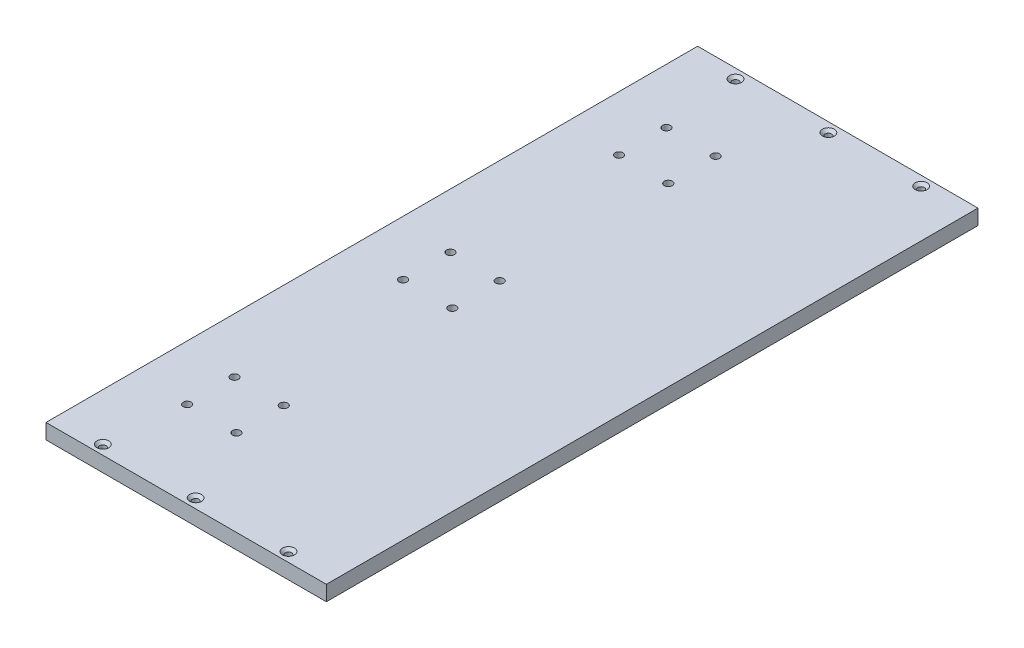
ISO-10303-21;
HEADER;
FILE_DESCRIPTION(('STEP AP214'),'2;1');
FILE_NAME('part.step','',(''),(''),'','','');
FILE_SCHEMA(('AUTOMOTIVE_DESIGN { 1 0 10303 214 1 1 1 1 }'));
ENDSEC;
DATA;
#1=APPLICATION_CONTEXT('core data for automotive mechanical design processes');
#2=APPLICATION_PROTOCOL_DEFINITION('international standard','automotive_design',2000,#1);
#3=PRODUCT_CONTEXT('',#1,'mechanical');
#4=PRODUCT('Part','Part','',(#3));
#5=PRODUCT_RELATED_PRODUCT_CATEGORY('part','',(#4));
#6=PRODUCT_DEFINITION_FORMATION('','',#4);
#7=PRODUCT_DEFINITION_CONTEXT('part definition',#1,'design');
#8=PRODUCT_DEFINITION('design','',#6,#7);
#9=PRODUCT_DEFINITION_SHAPE('','',#8);
#10=(LENGTH_UNIT() NAMED_UNIT(*) SI_UNIT(.MILLI.,.METRE.));
#11=(NAMED_UNIT(*) PLANE_ANGLE_UNIT() SI_UNIT($,.RADIAN.));
#12=(NAMED_UNIT(*) SI_UNIT($,.STERADIAN.) SOLID_ANGLE_UNIT());
#13=UNCERTAINTY_MEASURE_WITH_UNIT(LENGTH_MEASURE(1.E-05),#10,'distance_accuracy_value','');
#14=(GEOMETRIC_REPRESENTATION_CONTEXT(3) GLOBAL_UNCERTAINTY_ASSIGNED_CONTEXT((#13)) GLOBAL_UNIT_ASSIGNED_CONTEXT((#10,
#11,#12)) REPRESENTATION_CONTEXT('',''));
#15=CARTESIAN_POINT('',(0.,0.,0.));
#16=DIRECTION('',(0.,0.,1.));
#17=DIRECTION('',(1.,0.,0.));
#18=AXIS2_PLACEMENT_3D('',#15,#16,#17);
#19=CARTESIAN_POINT('',(0.,0.,0.));
#20=DIRECTION('',(0.,-1.,0.));
#21=DIRECTION('',(0.,0.,-1.));
#22=AXIS2_PLACEMENT_3D('',#19,#20,#21);
#23=PLANE('',#22);
#24=CARTESIAN_POINT('',(-45.,0.,101.5));
#25=DIRECTION('',(0.,1.,0.));
#26=DIRECTION('',(0.,0.,1.));
#27=AXIS2_PLACEMENT_3D('',#24,#25,#26);
#28=CIRCLE('',#27,2.1);
#29=CARTESIAN_POINT('',(-45.,0.,103.6));
#30=VERTEX_POINT('',#29);
#31=EDGE_CURVE('E216',#30,#30,#28,.T.);
#32=ORIENTED_EDGE('',*,*,#31,.T.);
#33=EDGE_LOOP('',(#32));
#34=FACE_BOUND('',#33,.T.);
#35=CARTESIAN_POINT('',(-19.,0.,-126.5));
#36=DIRECTION('',(0.,1.,0.));
#37=DIRECTION('',(0.,0.,1.));
#38=AXIS2_PLACEMENT_3D('',#35,#36,#37);
#39=CIRCLE('',#38,2.1);
#40=CARTESIAN_POINT('',(-19.,0.,-124.4));
#41=VERTEX_POINT('',#40);
#42=EDGE_CURVE('E230',#41,#41,#39,.T.);
#43=ORIENTED_EDGE('',*,*,#42,.T.);
#44=EDGE_LOOP('',(#43));
#45=FACE_BOUND('',#44,.T.);
#46=DIRECTION('',(0.,0.,-1.));
#47=VECTOR('',#46,1.);
#48=CARTESIAN_POINT('',(74.,0.,172.));
#49=LINE('',#48,#47);
#50=CARTESIAN_POINT('',(74.,0.,172.));
#51=VERTEX_POINT('',#50);
#52=CARTESIAN_POINT('',(74.,0.,-172.));
#53=VERTEX_POINT('',#52);
#54=EDGE_CURVE('E104',#51,#53,#49,.T.);
#55=ORIENTED_EDGE('',*,*,#54,.F.);
#56=DIRECTION('',(1.,0.,0.));
#57=VECTOR('',#56,1.);
#58=CARTESIAN_POINT('',(-74.,0.,172.));
#59=LINE('',#58,#57);
#60=CARTESIAN_POINT('',(-74.,0.,172.));
#61=VERTEX_POINT('',#60);
#62=EDGE_CURVE('E78',#61,#51,#59,.T.);
#63=ORIENTED_EDGE('',*,*,#62,.F.);
#64=DIRECTION('',(0.,0.,1.));
#65=VECTOR('',#64,1.);
#66=CARTESIAN_POINT('',(-74.,0.,172.));
#67=LINE('',#66,#65);
#68=CARTESIAN_POINT('',(-74.,0.,-172.));
#69=VERTEX_POINT('',#68);
#70=EDGE_CURVE('E72',#69,#61,#67,.T.);
#71=ORIENTED_EDGE('',*,*,#70,.F.);
#72=DIRECTION('',(-1.,0.,0.));
#73=VECTOR('',#72,1.);
#74=CARTESIAN_POINT('',(-74.,0.,-172.));
#75=LINE('',#74,#73);
#76=EDGE_CURVE('E95',#53,#69,#75,.T.);
#77=ORIENTED_EDGE('',*,*,#76,.F.);
#78=EDGE_LOOP('',(#55,#63,#71,#77));
#79=FACE_BOUND('',#78,.T.);
#80=CARTESIAN_POINT('',(49.,0.,167.));
#81=DIRECTION('',(0.,-1.,0.));
#82=DIRECTION('',(0.,0.,-1.));
#83=AXIS2_PLACEMENT_3D('',#80,#81,#82);
#84=CIRCLE('',#83,1.7);
#85=CARTESIAN_POINT('',(49.,0.,165.3));
#86=VERTEX_POINT('',#85);
#87=EDGE_CURVE('E107',#86,#86,#84,.T.);
#88=ORIENTED_EDGE('',*,*,#87,.F.);
#89=EDGE_LOOP('',(#88));
#90=FACE_BOUND('',#89,.T.);
#91=CARTESIAN_POINT('',(0.,0.,167.));
#92=DIRECTION('',(0.,-1.,0.));
#93=DIRECTION('',(0.,0.,-1.));
#94=AXIS2_PLACEMENT_3D('',#91,#92,#93);
#95=CIRCLE('',#94,1.7);
#96=CARTESIAN_POINT('',(0.,0.,165.3));
#97=VERTEX_POINT('',#96);
#98=EDGE_CURVE('E116',#97,#97,#95,.T.);
#99=ORIENTED_EDGE('',*,*,#98,.F.);
#100=EDGE_LOOP('',(#99));
#101=FACE_BOUND('',#100,.T.);
#102=CARTESIAN_POINT('',(-49.,0.,167.));
#103=DIRECTION('',(0.,-1.,0.));
#104=DIRECTION('',(0.,0.,-1.));
#105=AXIS2_PLACEMENT_3D('',#102,#103,#104);
#106=CIRCLE('',#105,1.7);
#107=CARTESIAN_POINT('',(-49.,0.,165.3));
#108=VERTEX_POINT('',#107);
#109=EDGE_CURVE('E121',#108,#108,#106,.T.);
#110=ORIENTED_EDGE('',*,*,#109,.F.);
#111=EDGE_LOOP('',(#110));
#112=FACE_BOUND('',#111,.T.);
#113=CARTESIAN_POINT('',(49.,0.,-167.));
#114=DIRECTION('',(0.,-1.,0.));
#115=DIRECTION('',(0.,0.,-1.));
#116=AXIS2_PLACEMENT_3D('',#113,#114,#115);
#117=CIRCLE('',#116,1.7);
#118=CARTESIAN_POINT('',(49.,0.,-168.7));
#119=VERTEX_POINT('',#118);
#120=EDGE_CURVE('E126',#119,#119,#117,.T.);
#121=ORIENTED_EDGE('',*,*,#120,.F.);
#122=EDGE_LOOP('',(#121));
#123=FACE_BOUND('',#122,.T.);
#124=CARTESIAN_POINT('',(0.,0.,-167.));
#125=DIRECTION('',(0.,-1.,0.));
#126=DIRECTION('',(0.,0.,-1.));
#127=AXIS2_PLACEMENT_3D('',#124,#125,#126);
#128=CIRCLE('',#127,1.7);
#129=CARTESIAN_POINT('',(0.,0.,-168.7));
#130=VERTEX_POINT('',#129);
#131=EDGE_CURVE('E130',#130,#130,#128,.T.);
#132=ORIENTED_EDGE('',*,*,#131,.F.);
#133=EDGE_LOOP('',(#132));
#134=FACE_BOUND('',#133,.T.);
#135=CARTESIAN_POINT('',(-49.,0.,-167.));
#136=DIRECTION('',(0.,-1.,0.));
#137=DIRECTION('',(0.,0.,-1.));
#138=AXIS2_PLACEMENT_3D('',#135,#136,#137);
#139=CIRCLE('',#138,1.7);
#140=CARTESIAN_POINT('',(-49.,0.,-168.7));
#141=VERTEX_POINT('',#140);
#142=EDGE_CURVE('E40',#141,#141,#139,.T.);
#143=ORIENTED_EDGE('',*,*,#142,.F.);
#144=EDGE_LOOP('',(#143));
#145=FACE_BOUND('',#144,.T.);
#146=CARTESIAN_POINT('',(-19.,0.,12.5));
#147=DIRECTION('',(0.,1.,0.));
#148=DIRECTION('',(0.,0.,1.));
#149=AXIS2_PLACEMENT_3D('',#146,#147,#148);
#150=CIRCLE('',#149,2.1);
#151=CARTESIAN_POINT('',(-19.,0.,14.6));
#152=VERTEX_POINT('',#151);
#153=EDGE_CURVE('E268',#152,#152,#150,.T.);
#154=ORIENTED_EDGE('',*,*,#153,.T.);
#155=EDGE_LOOP('',(#154));
#156=FACE_BOUND('',#155,.T.);
#157=CARTESIAN_POINT('',(-45.,0.,12.5));
#158=DIRECTION('',(0.,1.,0.));
#159=DIRECTION('',(0.,0.,1.));
#160=AXIS2_PLACEMENT_3D('',#157,#158,#159);
#161=CIRCLE('',#160,2.1);
#162=CARTESIAN_POINT('',(-45.,0.,14.6));
#163=VERTEX_POINT('',#162);
#164=EDGE_CURVE('E262',#163,#163,#161,.T.);
#165=ORIENTED_EDGE('',*,*,#164,.T.);
#166=EDGE_LOOP('',(#165));
#167=FACE_BOUND('',#166,.T.);
#168=CARTESIAN_POINT('',(-45.,0.,-12.5));
#169=DIRECTION('',(0.,1.,0.));
#170=DIRECTION('',(0.,0.,1.));
#171=AXIS2_PLACEMENT_3D('',#168,#169,#170);
#172=CIRCLE('',#171,2.1);
#173=CARTESIAN_POINT('',(-45.,0.,-10.4));
#174=VERTEX_POINT('',#173);
#175=EDGE_CURVE('E256',#174,#174,#172,.T.);
#176=ORIENTED_EDGE('',*,*,#175,.T.);
#177=EDGE_LOOP('',(#176));
#178=FACE_BOUND('',#177,.T.);
#179=CARTESIAN_POINT('',(-19.,0.,-12.5));
#180=DIRECTION('',(0.,1.,0.));
#181=DIRECTION('',(0.,0.,1.));
#182=AXIS2_PLACEMENT_3D('',#179,#180,#181);
#183=CIRCLE('',#182,2.1);
#184=CARTESIAN_POINT('',(-19.,0.,-10.4));
#185=VERTEX_POINT('',#184);
#186=EDGE_CURVE('E250',#185,#185,#183,.T.);
#187=ORIENTED_EDGE('',*,*,#186,.T.);
#188=EDGE_LOOP('',(#187));
#189=FACE_BOUND('',#188,.T.);
#190=CARTESIAN_POINT('',(-19.,0.,-101.5));
#191=DIRECTION('',(0.,1.,0.));
#192=DIRECTION('',(0.,0.,1.));
#193=AXIS2_PLACEMENT_3D('',#190,#191,#192);
#194=CIRCLE('',#193,2.1);
#195=CARTESIAN_POINT('',(-19.,0.,-99.4));
#196=VERTEX_POINT('',#195);
#197=EDGE_CURVE('E244',#196,#196,#194,.T.);
#198=ORIENTED_EDGE('',*,*,#197,.T.);
#199=EDGE_LOOP('',(#198));
#200=FACE_BOUND('',#199,.T.);
#201=CARTESIAN_POINT('',(-45.,0.,-101.5));
#202=DIRECTION('',(0.,1.,0.));
#203=DIRECTION('',(0.,0.,1.));
#204=AXIS2_PLACEMENT_3D('',#201,#202,#203);
#205=CIRCLE('',#204,2.1);
#206=CARTESIAN_POINT('',(-45.,0.,-99.4));
#207=VERTEX_POINT('',#206);
#208=EDGE_CURVE('E240',#207,#207,#205,.T.);
#209=ORIENTED_EDGE('',*,*,#208,.T.);
#210=EDGE_LOOP('',(#209));
#211=FACE_BOUND('',#210,.T.);
#212=CARTESIAN_POINT('',(-45.,0.,-126.5));
#213=DIRECTION('',(0.,1.,0.));
#214=DIRECTION('',(0.,0.,1.));
#215=AXIS2_PLACEMENT_3D('',#212,#213,#214);
#216=CIRCLE('',#215,2.1);
#217=CARTESIAN_POINT('',(-45.,0.,-124.4));
#218=VERTEX_POINT('',#217);
#219=EDGE_CURVE('E234',#218,#218,#216,.T.);
#220=ORIENTED_EDGE('',*,*,#219,.T.);
#221=EDGE_LOOP('',(#220));
#222=FACE_BOUND('',#221,.T.);
#223=CARTESIAN_POINT('',(-19.,0.,126.5));
#224=DIRECTION('',(0.,1.,0.));
#225=DIRECTION('',(0.,0.,1.));
#226=AXIS2_PLACEMENT_3D('',#223,#224,#225);
#227=CIRCLE('',#226,2.1);
#228=CARTESIAN_POINT('',(-19.,0.,128.6));
#229=VERTEX_POINT('',#228);
#230=EDGE_CURVE('E226',#229,#229,#227,.T.);
#231=ORIENTED_EDGE('',*,*,#230,.T.);
#232=EDGE_LOOP('',(#231));
#233=FACE_BOUND('',#232,.T.);
#234=CARTESIAN_POINT('',(-45.,0.,126.5));
#235=DIRECTION('',(0.,1.,0.));
#236=DIRECTION('',(0.,0.,1.));
#237=AXIS2_PLACEMENT_3D('',#234,#235,#236);
#238=CIRCLE('',#237,2.1);
#239=CARTESIAN_POINT('',(-45.,0.,128.6));
#240=VERTEX_POINT('',#239);
#241=EDGE_CURVE('E222',#240,#240,#238,.T.);
#242=ORIENTED_EDGE('',*,*,#241,.T.);
#243=EDGE_LOOP('',(#242));
#244=FACE_BOUND('',#243,.T.);
#245=CARTESIAN_POINT('',(-19.,0.,101.5));
#246=DIRECTION('',(0.,1.,0.));
#247=DIRECTION('',(0.,0.,1.));
#248=AXIS2_PLACEMENT_3D('',#245,#246,#247);
#249=CIRCLE('',#248,2.1);
#250=CARTESIAN_POINT('',(-19.,0.,103.6));
#251=VERTEX_POINT('',#250);
#252=EDGE_CURVE('E210',#251,#251,#249,.T.);
#253=ORIENTED_EDGE('',*,*,#252,.T.);
#254=EDGE_LOOP('',(#253));
#255=FACE_BOUND('',#254,.T.);
#256=ADVANCED_FACE('F36',(#34,#45,#79,#90,#101,#112,#123,#134,#145,#156,#167,#178,#189,#200,
#211,#222,#233,#244,#255),#23,.T.);
#257=CARTESIAN_POINT('',(0.,8.,0.));
#258=DIRECTION('',(0.,-1.,0.));
#259=DIRECTION('',(0.,0.,-1.));
#260=AXIS2_PLACEMENT_3D('',#257,#258,#259);
#261=PLANE('',#260);
#262=CARTESIAN_POINT('',(-45.,8.,126.5));
#263=DIRECTION('',(0.,1.,0.));
#264=DIRECTION('',(0.,0.,1.));
#265=AXIS2_PLACEMENT_3D('',#262,#263,#264);
#266=CIRCLE('',#265,2.09999999999998);
#267=CARTESIAN_POINT('',(-45.,8.,128.6));
#268=VERTEX_POINT('',#267);
#269=EDGE_CURVE('E219',#268,#268,#266,.T.);
#270=ORIENTED_EDGE('',*,*,#269,.F.);
#271=EDGE_LOOP('',(#270));
#272=FACE_BOUND('',#271,.T.);
#273=CARTESIAN_POINT('',(-45.,8.,-101.5));
#274=DIRECTION('',(0.,1.,0.));
#275=DIRECTION('',(0.,0.,1.));
#276=AXIS2_PLACEMENT_3D('',#273,#274,#275);
#277=CIRCLE('',#276,2.09999999999998);
#278=CARTESIAN_POINT('',(-45.,8.,-99.4));
#279=VERTEX_POINT('',#278);
#280=EDGE_CURVE('E237',#279,#279,#277,.T.);
#281=ORIENTED_EDGE('',*,*,#280,.F.);
#282=EDGE_LOOP('',(#281));
#283=FACE_BOUND('',#282,.T.);
#284=CARTESIAN_POINT('',(-19.,8.,-12.5));
#285=DIRECTION('',(0.,1.,0.));
#286=DIRECTION('',(0.,0.,1.));
#287=AXIS2_PLACEMENT_3D('',#284,#285,#286);
#288=CIRCLE('',#287,2.09999999999999);
#289=CARTESIAN_POINT('',(-19.,8.,-10.4));
#290=VERTEX_POINT('',#289);
#291=EDGE_CURVE('E247',#290,#290,#288,.T.);
#292=ORIENTED_EDGE('',*,*,#291,.F.);
#293=EDGE_LOOP('',(#292));
#294=FACE_BOUND('',#293,.T.);
#295=CARTESIAN_POINT('',(-45.,8.,-12.5));
#296=DIRECTION('',(0.,1.,0.));
#297=DIRECTION('',(0.,0.,1.));
#298=AXIS2_PLACEMENT_3D('',#295,#296,#297);
#299=CIRCLE('',#298,2.09999999999998);
#300=CARTESIAN_POINT('',(-45.,8.,-10.4));
#301=VERTEX_POINT('',#300);
#302=EDGE_CURVE('E253',#301,#301,#299,.T.);
#303=ORIENTED_EDGE('',*,*,#302,.F.);
#304=EDGE_LOOP('',(#303));
#305=FACE_BOUND('',#304,.T.);
#306=CARTESIAN_POINT('',(-45.,8.,12.5));
#307=DIRECTION('',(0.,1.,0.));
#308=DIRECTION('',(0.,0.,1.));
#309=AXIS2_PLACEMENT_3D('',#306,#307,#308);
#310=CIRCLE('',#309,2.09999999999998);
#311=CARTESIAN_POINT('',(-45.,8.,14.6));
#312=VERTEX_POINT('',#311);
#313=EDGE_CURVE('E259',#312,#312,#310,.T.);
#314=ORIENTED_EDGE('',*,*,#313,.F.);
#315=EDGE_LOOP('',(#314));
#316=FACE_BOUND('',#315,.T.);
#317=CARTESIAN_POINT('',(-19.,8.,12.5));
#318=DIRECTION('',(0.,1.,0.));
#319=DIRECTION('',(0.,0.,1.));
#320=AXIS2_PLACEMENT_3D('',#317,#318,#319);
#321=CIRCLE('',#320,2.09999999999999);
#322=CARTESIAN_POINT('',(-19.,8.,14.6));
#323=VERTEX_POINT('',#322);
#324=EDGE_CURVE('E265',#323,#323,#321,.T.);
#325=ORIENTED_EDGE('',*,*,#324,.F.);
#326=EDGE_LOOP('',(#325));
#327=FACE_BOUND('',#326,.T.);
#328=DIRECTION('',(0.,0.,-1.));
#329=VECTOR('',#328,1.);
#330=CARTESIAN_POINT('',(74.,8.,172.));
#331=LINE('',#330,#329);
#332=CARTESIAN_POINT('',(74.,8.,172.));
#333=VERTEX_POINT('',#332);
#334=CARTESIAN_POINT('',(74.,8.,-172.));
#335=VERTEX_POINT('',#334);
#336=EDGE_CURVE('E91',#333,#335,#331,.T.);
#337=ORIENTED_EDGE('',*,*,#336,.T.);
#338=DIRECTION('',(-1.,0.,0.));
#339=VECTOR('',#338,1.);
#340=CARTESIAN_POINT('',(-74.,8.,-172.));
#341=LINE('',#340,#339);
#342=CARTESIAN_POINT('',(-74.,8.,-172.));
#343=VERTEX_POINT('',#342);
#344=EDGE_CURVE('E85',#335,#343,#341,.T.);
#345=ORIENTED_EDGE('',*,*,#344,.T.);
#346=DIRECTION('',(0.,0.,1.));
#347=VECTOR('',#346,1.);
#348=CARTESIAN_POINT('',(-74.,8.,172.));
#349=LINE('',#348,#347);
#350=CARTESIAN_POINT('',(-74.,8.,172.));
#351=VERTEX_POINT('',#350);
#352=EDGE_CURVE('E89',#343,#351,#349,.T.);
#353=ORIENTED_EDGE('',*,*,#352,.T.);
#354=DIRECTION('',(1.,0.,0.));
#355=VECTOR('',#354,1.);
#356=CARTESIAN_POINT('',(-74.,8.,172.));
#357=LINE('',#356,#355);
#358=EDGE_CURVE('E55',#351,#333,#357,.T.);
#359=ORIENTED_EDGE('',*,*,#358,.T.);
#360=EDGE_LOOP('',(#337,#345,#353,#359));
#361=FACE_BOUND('',#360,.T.);
#362=CARTESIAN_POINT('',(49.,8.,167.));
#363=DIRECTION('',(0.,1.,0.));
#364=DIRECTION('',(0.,0.,1.));
#365=AXIS2_PLACEMENT_3D('',#362,#363,#364);
#366=CIRCLE('',#365,3.15);
#367=CARTESIAN_POINT('',(49.,8.,170.15));
#368=VERTEX_POINT('',#367);
#369=EDGE_CURVE('E119',#368,#368,#366,.T.);
#370=ORIENTED_EDGE('',*,*,#369,.F.);
#371=EDGE_LOOP('',(#370));
#372=FACE_BOUND('',#371,.T.);
#373=CARTESIAN_POINT('',(0.,8.,167.));
#374=DIRECTION('',(0.,1.,0.));
#375=DIRECTION('',(0.,0.,1.));
#376=AXIS2_PLACEMENT_3D('',#373,#374,#375);
#377=CIRCLE('',#376,3.15);
#378=CARTESIAN_POINT('',(0.,8.,170.15));
#379=VERTEX_POINT('',#378);
#380=EDGE_CURVE('E124',#379,#379,#377,.T.);
#381=ORIENTED_EDGE('',*,*,#380,.F.);
#382=EDGE_LOOP('',(#381));
#383=FACE_BOUND('',#382,.T.);
#384=CARTESIAN_POINT('',(-49.,8.,167.));
#385=DIRECTION('',(0.,1.,0.));
#386=DIRECTION('',(0.,0.,1.));
#387=AXIS2_PLACEMENT_3D('',#384,#385,#386);
#388=CIRCLE('',#387,3.15);
#389=CARTESIAN_POINT('',(-49.,8.,170.15));
#390=VERTEX_POINT('',#389);
#391=EDGE_CURVE('E128',#390,#390,#388,.T.);
#392=ORIENTED_EDGE('',*,*,#391,.F.);
#393=EDGE_LOOP('',(#392));
#394=FACE_BOUND('',#393,.T.);
#395=CARTESIAN_POINT('',(49.,8.,-167.));
#396=DIRECTION('',(0.,1.,0.));
#397=DIRECTION('',(0.,0.,1.));
#398=AXIS2_PLACEMENT_3D('',#395,#396,#397);
#399=CIRCLE('',#398,3.15);
#400=CARTESIAN_POINT('',(49.,8.,-163.85));
#401=VERTEX_POINT('',#400);
#402=EDGE_CURVE('E132',#401,#401,#399,.T.);
#403=ORIENTED_EDGE('',*,*,#402,.F.);
#404=EDGE_LOOP('',(#403));
#405=FACE_BOUND('',#404,.T.);
#406=CARTESIAN_POINT('',(0.,8.,-167.));
#407=DIRECTION('',(0.,1.,0.));
#408=DIRECTION('',(0.,0.,1.));
#409=AXIS2_PLACEMENT_3D('',#406,#407,#408);
#410=CIRCLE('',#409,3.15);
#411=CARTESIAN_POINT('',(0.,8.,-163.85));
#412=VERTEX_POINT('',#411);
#413=EDGE_CURVE('E139',#412,#412,#410,.T.);
#414=ORIENTED_EDGE('',*,*,#413,.F.);
#415=EDGE_LOOP('',(#414));
#416=FACE_BOUND('',#415,.T.);
#417=CARTESIAN_POINT('',(-49.,8.,-167.));
#418=DIRECTION('',(0.,1.,0.));
#419=DIRECTION('',(0.,0.,1.));
#420=AXIS2_PLACEMENT_3D('',#417,#418,#419);
#421=CIRCLE('',#420,3.15);
#422=CARTESIAN_POINT('',(-49.,8.,-163.85));
#423=VERTEX_POINT('',#422);
#424=EDGE_CURVE('E185',#423,#423,#421,.T.);
#425=ORIENTED_EDGE('',*,*,#424,.F.);
#426=EDGE_LOOP('',(#425));
#427=FACE_BOUND('',#426,.T.);
#428=CARTESIAN_POINT('',(-19.,8.,-101.5));
#429=DIRECTION('',(0.,1.,0.));
#430=DIRECTION('',(0.,0.,1.));
#431=AXIS2_PLACEMENT_3D('',#428,#429,#430);
#432=CIRCLE('',#431,2.09999999999999);
#433=CARTESIAN_POINT('',(-19.,8.,-99.4));
#434=VERTEX_POINT('',#433);
#435=EDGE_CURVE('E189',#434,#434,#432,.T.);
#436=ORIENTED_EDGE('',*,*,#435,.F.);
#437=EDGE_LOOP('',(#436));
#438=FACE_BOUND('',#437,.T.);
#439=CARTESIAN_POINT('',(-45.,8.,-126.5));
#440=DIRECTION('',(0.,1.,0.));
#441=DIRECTION('',(0.,0.,1.));
#442=AXIS2_PLACEMENT_3D('',#439,#440,#441);
#443=CIRCLE('',#442,2.09999999999998);
#444=CARTESIAN_POINT('',(-45.,8.,-124.4));
#445=VERTEX_POINT('',#444);
#446=EDGE_CURVE('E193',#445,#445,#443,.T.);
#447=ORIENTED_EDGE('',*,*,#446,.F.);
#448=EDGE_LOOP('',(#447));
#449=FACE_BOUND('',#448,.T.);
#450=CARTESIAN_POINT('',(-19.,8.,-126.5));
#451=DIRECTION('',(0.,1.,0.));
#452=DIRECTION('',(0.,0.,1.));
#453=AXIS2_PLACEMENT_3D('',#450,#451,#452);
#454=CIRCLE('',#453,2.09999999999999);
#455=CARTESIAN_POINT('',(-19.,8.,-124.4));
#456=VERTEX_POINT('',#455);
#457=EDGE_CURVE('E197',#456,#456,#454,.T.);
#458=ORIENTED_EDGE('',*,*,#457,.F.);
#459=EDGE_LOOP('',(#458));
#460=FACE_BOUND('',#459,.T.);
#461=CARTESIAN_POINT('',(-19.,8.,126.5));
#462=DIRECTION('',(0.,1.,0.));
#463=DIRECTION('',(0.,0.,1.));
#464=AXIS2_PLACEMENT_3D('',#461,#462,#463);
#465=CIRCLE('',#464,2.09999999999999);
#466=CARTESIAN_POINT('',(-19.,8.,128.6));
#467=VERTEX_POINT('',#466);
#468=EDGE_CURVE('E201',#467,#467,#465,.T.);
#469=ORIENTED_EDGE('',*,*,#468,.F.);
#470=EDGE_LOOP('',(#469));
#471=FACE_BOUND('',#470,.T.);
#472=CARTESIAN_POINT('',(-45.,8.,101.5));
#473=DIRECTION('',(0.,1.,0.));
#474=DIRECTION('',(0.,0.,1.));
#475=AXIS2_PLACEMENT_3D('',#472,#473,#474);
#476=CIRCLE('',#475,2.09999999999998);
#477=CARTESIAN_POINT('',(-45.,8.,103.6));
#478=VERTEX_POINT('',#477);
#479=EDGE_CURVE('E205',#478,#478,#476,.T.);
#480=ORIENTED_EDGE('',*,*,#479,.F.);
#481=EDGE_LOOP('',(#480));
#482=FACE_BOUND('',#481,.T.);
#483=CARTESIAN_POINT('',(-19.,8.,101.5));
#484=DIRECTION('',(0.,1.,0.));
#485=DIRECTION('',(0.,0.,1.));
#486=AXIS2_PLACEMENT_3D('',#483,#484,#485);
#487=CIRCLE('',#486,2.09999999999999);
#488=CARTESIAN_POINT('',(-19.,8.,103.6));
#489=VERTEX_POINT('',#488);
#490=EDGE_CURVE('E208',#489,#489,#487,.T.);
#491=ORIENTED_EDGE('',*,*,#490,.F.);
#492=EDGE_LOOP('',(#491));
#493=FACE_BOUND('',#492,.T.);
#494=ADVANCED_FACE('F86',(#272,#283,#294,#305,#316,#327,#361,#372,#383,#394,#405,#416,#427,#438,
#449,#460,#471,#482,#493),#261,.F.);
#495=CARTESIAN_POINT('',(74.,8.,172.));
#496=DIRECTION('',(-1.,0.,0.));
#497=DIRECTION('',(0.,0.,1.));
#498=AXIS2_PLACEMENT_3D('',#495,#496,#497);
#499=PLANE('',#498);
#500=ORIENTED_EDGE('',*,*,#54,.T.);
#501=DIRECTION('',(0.,-1.,0.));
#502=VECTOR('',#501,1.);
#503=CARTESIAN_POINT('',(74.,8.,-172.));
#504=LINE('',#503,#502);
#505=EDGE_CURVE('E11',#335,#53,#504,.T.);
#506=ORIENTED_EDGE('',*,*,#505,.F.);
#507=ORIENTED_EDGE('',*,*,#336,.F.);
#508=DIRECTION('',(0.,-1.,0.));
#509=VECTOR('',#508,1.);
#510=CARTESIAN_POINT('',(74.,8.,172.));
#511=LINE('',#510,#509);
#512=EDGE_CURVE('E100',#333,#51,#511,.T.);
#513=ORIENTED_EDGE('',*,*,#512,.T.);
#514=EDGE_LOOP('',(#500,#506,#507,#513));
#515=FACE_BOUND('',#514,.T.);
#516=ADVANCED_FACE('F38',(#515),#499,.F.);
#517=CARTESIAN_POINT('',(-74.,8.,-172.));
#518=DIRECTION('',(0.,0.,1.));
#519=DIRECTION('',(1.,0.,0.));
#520=AXIS2_PLACEMENT_3D('',#517,#518,#519);
#521=PLANE('',#520);
#522=ORIENTED_EDGE('',*,*,#76,.T.);
#523=DIRECTION('',(0.,-1.,0.));
#524=VECTOR('',#523,1.);
#525=CARTESIAN_POINT('',(-74.,8.,-172.));
#526=LINE('',#525,#524);
#527=EDGE_CURVE('E46',#343,#69,#526,.T.);
#528=ORIENTED_EDGE('',*,*,#527,.F.);
#529=ORIENTED_EDGE('',*,*,#344,.F.);
#530=ORIENTED_EDGE('',*,*,#505,.T.);
#531=EDGE_LOOP('',(#522,#528,#529,#530));
#532=FACE_BOUND('',#531,.T.);
#533=ADVANCED_FACE('F94',(#532),#521,.F.);
#534=CARTESIAN_POINT('',(-74.,8.,172.));
#535=DIRECTION('',(1.,0.,0.));
#536=DIRECTION('',(0.,0.,-1.));
#537=AXIS2_PLACEMENT_3D('',#534,#535,#536);
#538=PLANE('',#537);
#539=ORIENTED_EDGE('',*,*,#70,.T.);
#540=DIRECTION('',(0.,-1.,0.));
#541=VECTOR('',#540,1.);
#542=CARTESIAN_POINT('',(-74.,8.,172.));
#543=LINE('',#542,#541);
#544=EDGE_CURVE('E96',#351,#61,#543,.T.);
#545=ORIENTED_EDGE('',*,*,#544,.F.);
#546=ORIENTED_EDGE('',*,*,#352,.F.);
#547=ORIENTED_EDGE('',*,*,#527,.T.);
#548=EDGE_LOOP('',(#539,#545,#546,#547));
#549=FACE_BOUND('',#548,.T.);
#550=ADVANCED_FACE('F98',(#549),#538,.F.);
#551=CARTESIAN_POINT('',(-74.,8.,172.));
#552=DIRECTION('',(0.,0.,-1.));
#553=DIRECTION('',(-1.,0.,0.));
#554=AXIS2_PLACEMENT_3D('',#551,#552,#553);
#555=PLANE('',#554);
#556=ORIENTED_EDGE('',*,*,#62,.T.);
#557=ORIENTED_EDGE('',*,*,#512,.F.);
#558=ORIENTED_EDGE('',*,*,#358,.F.);
#559=ORIENTED_EDGE('',*,*,#544,.T.);
#560=EDGE_LOOP('',(#556,#557,#558,#559));
#561=FACE_BOUND('',#560,.T.);
#562=ADVANCED_FACE('F391',(#561),#555,.F.);
#563=CARTESIAN_POINT('',(49.,8.,167.));
#564=DIRECTION('',(0.,1.,0.));
#565=DIRECTION('',(0.,0.,1.));
#566=AXIS2_PLACEMENT_3D('',#563,#564,#565);
#567=CYLINDRICAL_SURFACE('',#566,1.7);
#568=ORIENTED_EDGE('',*,*,#87,.T.);
#569=EDGE_LOOP('',(#568));
#570=FACE_BOUND('',#569,.T.);
#571=CARTESIAN_POINT('',(49.,6.55,167.));
#572=DIRECTION('',(0.,1.,0.));
#573=DIRECTION('',(0.,0.,1.));
#574=AXIS2_PLACEMENT_3D('',#571,#572,#573);
#575=CIRCLE('',#574,1.7);
#576=CARTESIAN_POINT('',(49.,6.55,168.7));
#577=VERTEX_POINT('',#576);
#578=EDGE_CURVE('E115',#577,#577,#575,.T.);
#579=ORIENTED_EDGE('',*,*,#578,.T.);
#580=EDGE_LOOP('',(#579));
#581=FACE_BOUND('',#580,.T.);
#582=ADVANCED_FACE('F162',(#570,#581),#567,.F.);
#583=CARTESIAN_POINT('',(49.,8.,167.));
#584=DIRECTION('',(0.,1.,0.));
#585=DIRECTION('',(0.,0.,1.));
#586=AXIS2_PLACEMENT_3D('',#583,#584,#585);
#587=CONICAL_SURFACE('',#586,3.15,0.785398163397448);
#588=ORIENTED_EDGE('',*,*,#578,.F.);
#589=EDGE_LOOP('',(#588));
#590=FACE_BOUND('',#589,.T.);
#591=ORIENTED_EDGE('',*,*,#369,.T.);
#592=EDGE_LOOP('',(#591));
#593=FACE_BOUND('',#592,.T.);
#594=ADVANCED_FACE('F164',(#590,#593),#587,.F.);
#595=CARTESIAN_POINT('',(0.,8.,167.));
#596=DIRECTION('',(0.,1.,0.));
#597=DIRECTION('',(0.,0.,1.));
#598=AXIS2_PLACEMENT_3D('',#595,#596,#597);
#599=CYLINDRICAL_SURFACE('',#598,1.7);
#600=ORIENTED_EDGE('',*,*,#98,.T.);
#601=EDGE_LOOP('',(#600));
#602=FACE_BOUND('',#601,.T.);
#603=CARTESIAN_POINT('',(0.,6.55,167.));
#604=DIRECTION('',(0.,1.,0.));
#605=DIRECTION('',(0.,0.,1.));
#606=AXIS2_PLACEMENT_3D('',#603,#604,#605);
#607=CIRCLE('',#606,1.7);
#608=CARTESIAN_POINT('',(0.,6.55,168.7));
#609=VERTEX_POINT('',#608);
#610=EDGE_CURVE('E120',#609,#609,#607,.T.);
#611=ORIENTED_EDGE('',*,*,#610,.T.);
#612=EDGE_LOOP('',(#611));
#613=FACE_BOUND('',#612,.T.);
#614=ADVANCED_FACE('F167',(#602,#613),#599,.F.);
#615=CARTESIAN_POINT('',(0.,8.,167.));
#616=DIRECTION('',(0.,1.,0.));
#617=DIRECTION('',(0.,0.,1.));
#618=AXIS2_PLACEMENT_3D('',#615,#616,#617);
#619=CONICAL_SURFACE('',#618,3.15,0.785398163397449);
#620=ORIENTED_EDGE('',*,*,#610,.F.);
#621=EDGE_LOOP('',(#620));
#622=FACE_BOUND('',#621,.T.);
#623=ORIENTED_EDGE('',*,*,#380,.T.);
#624=EDGE_LOOP('',(#623));
#625=FACE_BOUND('',#624,.T.);
#626=ADVANCED_FACE('F382',(#622,#625),#619,.F.);
#627=CARTESIAN_POINT('',(-49.,8.,167.));
#628=DIRECTION('',(0.,1.,0.));
#629=DIRECTION('',(0.,0.,1.));
#630=AXIS2_PLACEMENT_3D('',#627,#628,#629);
#631=CYLINDRICAL_SURFACE('',#630,1.7);
#632=ORIENTED_EDGE('',*,*,#109,.T.);
#633=EDGE_LOOP('',(#632));
#634=FACE_BOUND('',#633,.T.);
#635=CARTESIAN_POINT('',(-49.,6.55,167.));
#636=DIRECTION('',(0.,1.,0.));
#637=DIRECTION('',(0.,0.,1.));
#638=AXIS2_PLACEMENT_3D('',#635,#636,#637);
#639=CIRCLE('',#638,1.7);
#640=CARTESIAN_POINT('',(-49.,6.55,168.7));
#641=VERTEX_POINT('',#640);
#642=EDGE_CURVE('E125',#641,#641,#639,.T.);
#643=ORIENTED_EDGE('',*,*,#642,.T.);
#644=EDGE_LOOP('',(#643));
#645=FACE_BOUND('',#644,.T.);
#646=ADVANCED_FACE('F378',(#634,#645),#631,.F.);
#647=CARTESIAN_POINT('',(-49.,8.,167.));
#648=DIRECTION('',(0.,1.,0.));
#649=DIRECTION('',(0.,0.,1.));
#650=AXIS2_PLACEMENT_3D('',#647,#648,#649);
#651=CONICAL_SURFACE('',#650,3.15,0.785398163397448);
#652=ORIENTED_EDGE('',*,*,#642,.F.);
#653=EDGE_LOOP('',(#652));
#654=FACE_BOUND('',#653,.T.);
#655=ORIENTED_EDGE('',*,*,#391,.T.);
#656=EDGE_LOOP('',(#655));
#657=FACE_BOUND('',#656,.T.);
#658=ADVANCED_FACE('F374',(#654,#657),#651,.F.);
#659=CARTESIAN_POINT('',(49.,8.,-167.));
#660=DIRECTION('',(0.,1.,0.));
#661=DIRECTION('',(0.,0.,1.));
#662=AXIS2_PLACEMENT_3D('',#659,#660,#661);
#663=CYLINDRICAL_SURFACE('',#662,1.7);
#664=ORIENTED_EDGE('',*,*,#120,.T.);
#665=EDGE_LOOP('',(#664));
#666=FACE_BOUND('',#665,.T.);
#667=CARTESIAN_POINT('',(49.,6.55,-167.));
#668=DIRECTION('',(0.,1.,0.));
#669=DIRECTION('',(0.,0.,1.));
#670=AXIS2_PLACEMENT_3D('',#667,#668,#669);
#671=CIRCLE('',#670,1.7);
#672=CARTESIAN_POINT('',(49.,6.55,-165.3));
#673=VERTEX_POINT('',#672);
#674=EDGE_CURVE('E129',#673,#673,#671,.T.);
#675=ORIENTED_EDGE('',*,*,#674,.T.);
#676=EDGE_LOOP('',(#675));
#677=FACE_BOUND('',#676,.T.);
#678=ADVANCED_FACE('F370',(#666,#677),#663,.F.);
#679=CARTESIAN_POINT('',(49.,8.,-167.));
#680=DIRECTION('',(0.,1.,0.));
#681=DIRECTION('',(0.,0.,1.));
#682=AXIS2_PLACEMENT_3D('',#679,#680,#681);
#683=CONICAL_SURFACE('',#682,3.15,0.785398163397448);
#684=ORIENTED_EDGE('',*,*,#674,.F.);
#685=EDGE_LOOP('',(#684));
#686=FACE_BOUND('',#685,.T.);
#687=ORIENTED_EDGE('',*,*,#402,.T.);
#688=EDGE_LOOP('',(#687));
#689=FACE_BOUND('',#688,.T.);
#690=ADVANCED_FACE('F367',(#686,#689),#683,.F.);
#691=CARTESIAN_POINT('',(0.,8.,-167.));
#692=DIRECTION('',(0.,1.,0.));
#693=DIRECTION('',(0.,0.,1.));
#694=AXIS2_PLACEMENT_3D('',#691,#692,#693);
#695=CYLINDRICAL_SURFACE('',#694,1.7);
#696=ORIENTED_EDGE('',*,*,#131,.T.);
#697=EDGE_LOOP('',(#696));
#698=FACE_BOUND('',#697,.T.);
#699=CARTESIAN_POINT('',(0.,6.55,-167.));
#700=DIRECTION('',(0.,1.,0.));
#701=DIRECTION('',(0.,0.,1.));
#702=AXIS2_PLACEMENT_3D('',#699,#700,#701);
#703=CIRCLE('',#702,1.7);
#704=CARTESIAN_POINT('',(0.,6.55,-165.3));
#705=VERTEX_POINT('',#704);
#706=EDGE_CURVE('E133',#705,#705,#703,.T.);
#707=ORIENTED_EDGE('',*,*,#706,.T.);
#708=EDGE_LOOP('',(#707));
#709=FACE_BOUND('',#708,.T.);
#710=ADVANCED_FACE('F363',(#698,#709),#695,.F.);
#711=CARTESIAN_POINT('',(0.,8.,-167.));
#712=DIRECTION('',(0.,1.,0.));
#713=DIRECTION('',(0.,0.,1.));
#714=AXIS2_PLACEMENT_3D('',#711,#712,#713);
#715=CONICAL_SURFACE('',#714,3.15,0.785398163397449);
#716=ORIENTED_EDGE('',*,*,#706,.F.);
#717=EDGE_LOOP('',(#716));
#718=FACE_BOUND('',#717,.T.);
#719=ORIENTED_EDGE('',*,*,#413,.T.);
#720=EDGE_LOOP('',(#719));
#721=FACE_BOUND('',#720,.T.);
#722=ADVANCED_FACE('F360',(#718,#721),#715,.F.);
#723=CARTESIAN_POINT('',(-49.,8.,-167.));
#724=DIRECTION('',(0.,1.,0.));
#725=DIRECTION('',(0.,0.,1.));
#726=AXIS2_PLACEMENT_3D('',#723,#724,#725);
#727=CYLINDRICAL_SURFACE('',#726,1.7);
#728=ORIENTED_EDGE('',*,*,#142,.T.);
#729=EDGE_LOOP('',(#728));
#730=FACE_BOUND('',#729,.T.);
#731=CARTESIAN_POINT('',(-49.,6.55,-167.));
#732=DIRECTION('',(0.,1.,0.));
#733=DIRECTION('',(0.,0.,1.));
#734=AXIS2_PLACEMENT_3D('',#731,#732,#733);
#735=CIRCLE('',#734,1.7);
#736=CARTESIAN_POINT('',(-49.,6.55,-165.3));
#737=VERTEX_POINT('',#736);
#738=EDGE_CURVE('E271',#737,#737,#735,.T.);
#739=ORIENTED_EDGE('',*,*,#738,.T.);
#740=EDGE_LOOP('',(#739));
#741=FACE_BOUND('',#740,.T.);
#742=ADVANCED_FACE('F278',(#730,#741),#727,.F.);
#743=CARTESIAN_POINT('',(-49.,8.,-167.));
#744=DIRECTION('',(0.,1.,0.));
#745=DIRECTION('',(0.,0.,1.));
#746=AXIS2_PLACEMENT_3D('',#743,#744,#745);
#747=CONICAL_SURFACE('',#746,3.15,0.785398163397448);
#748=ORIENTED_EDGE('',*,*,#738,.F.);
#749=EDGE_LOOP('',(#748));
#750=FACE_BOUND('',#749,.T.);
#751=ORIENTED_EDGE('',*,*,#424,.T.);
#752=EDGE_LOOP('',(#751));
#753=FACE_BOUND('',#752,.T.);
#754=ADVANCED_FACE('F353',(#750,#753),#747,.F.);
#755=CARTESIAN_POINT('',(-19.,8.,12.5));
#756=DIRECTION('',(0.,1.,0.));
#757=DIRECTION('',(0.,0.,1.));
#758=AXIS2_PLACEMENT_3D('',#755,#756,#757);
#759=CYLINDRICAL_SURFACE('',#758,2.09999999999999);
#760=ORIENTED_EDGE('',*,*,#153,.F.);
#761=EDGE_LOOP('',(#760));
#762=FACE_BOUND('',#761,.T.);
#763=ORIENTED_EDGE('',*,*,#324,.T.);
#764=EDGE_LOOP('',(#763));
#765=FACE_BOUND('',#764,.T.);
#766=ADVANCED_FACE('F349',(#762,#765),#759,.F.);
#767=CARTESIAN_POINT('',(-45.,8.,12.5));
#768=DIRECTION('',(0.,1.,0.));
#769=DIRECTION('',(0.,0.,1.));
#770=AXIS2_PLACEMENT_3D('',#767,#768,#769);
#771=CYLINDRICAL_SURFACE('',#770,2.09999999999999);
#772=ORIENTED_EDGE('',*,*,#164,.F.);
#773=EDGE_LOOP('',(#772));
#774=FACE_BOUND('',#773,.T.);
#775=ORIENTED_EDGE('',*,*,#313,.T.);
#776=EDGE_LOOP('',(#775));
#777=FACE_BOUND('',#776,.T.);
#778=ADVANCED_FACE('F345',(#774,#777),#771,.F.);
#779=CARTESIAN_POINT('',(-45.,8.,-12.5));
#780=DIRECTION('',(0.,1.,0.));
#781=DIRECTION('',(0.,0.,1.));
#782=AXIS2_PLACEMENT_3D('',#779,#780,#781);
#783=CYLINDRICAL_SURFACE('',#782,2.09999999999999);
#784=ORIENTED_EDGE('',*,*,#175,.F.);
#785=EDGE_LOOP('',(#784));
#786=FACE_BOUND('',#785,.T.);
#787=ORIENTED_EDGE('',*,*,#302,.T.);
#788=EDGE_LOOP('',(#787));
#789=FACE_BOUND('',#788,.T.);
#790=ADVANCED_FACE('F341',(#786,#789),#783,.F.);
#791=CARTESIAN_POINT('',(-19.,8.,-12.5));
#792=DIRECTION('',(0.,1.,0.));
#793=DIRECTION('',(0.,0.,1.));
#794=AXIS2_PLACEMENT_3D('',#791,#792,#793);
#795=CYLINDRICAL_SURFACE('',#794,2.09999999999999);
#796=ORIENTED_EDGE('',*,*,#186,.F.);
#797=EDGE_LOOP('',(#796));
#798=FACE_BOUND('',#797,.T.);
#799=ORIENTED_EDGE('',*,*,#291,.T.);
#800=EDGE_LOOP('',(#799));
#801=FACE_BOUND('',#800,.T.);
#802=ADVANCED_FACE('F337',(#798,#801),#795,.F.);
#803=CARTESIAN_POINT('',(-19.,8.,-101.5));
#804=DIRECTION('',(0.,1.,0.));
#805=DIRECTION('',(0.,0.,1.));
#806=AXIS2_PLACEMENT_3D('',#803,#804,#805);
#807=CYLINDRICAL_SURFACE('',#806,2.09999999999999);
#808=ORIENTED_EDGE('',*,*,#197,.F.);
#809=EDGE_LOOP('',(#808));
#810=FACE_BOUND('',#809,.T.);
#811=ORIENTED_EDGE('',*,*,#435,.T.);
#812=EDGE_LOOP('',(#811));
#813=FACE_BOUND('',#812,.T.);
#814=ADVANCED_FACE('F333',(#810,#813),#807,.F.);
#815=CARTESIAN_POINT('',(-45.,8.,-101.5));
#816=DIRECTION('',(0.,1.,0.));
#817=DIRECTION('',(0.,0.,1.));
#818=AXIS2_PLACEMENT_3D('',#815,#816,#817);
#819=CYLINDRICAL_SURFACE('',#818,2.09999999999999);
#820=ORIENTED_EDGE('',*,*,#208,.F.);
#821=EDGE_LOOP('',(#820));
#822=FACE_BOUND('',#821,.T.);
#823=ORIENTED_EDGE('',*,*,#280,.T.);
#824=EDGE_LOOP('',(#823));
#825=FACE_BOUND('',#824,.T.);
#826=ADVANCED_FACE('F329',(#822,#825),#819,.F.);
#827=CARTESIAN_POINT('',(-45.,8.,-126.5));
#828=DIRECTION('',(0.,1.,0.));
#829=DIRECTION('',(0.,0.,1.));
#830=AXIS2_PLACEMENT_3D('',#827,#828,#829);
#831=CYLINDRICAL_SURFACE('',#830,2.09999999999999);
#832=ORIENTED_EDGE('',*,*,#219,.F.);
#833=EDGE_LOOP('',(#832));
#834=FACE_BOUND('',#833,.T.);
#835=ORIENTED_EDGE('',*,*,#446,.T.);
#836=EDGE_LOOP('',(#835));
#837=FACE_BOUND('',#836,.T.);
#838=ADVANCED_FACE('F325',(#834,#837),#831,.F.);
#839=CARTESIAN_POINT('',(-19.,8.,-126.5));
#840=DIRECTION('',(0.,1.,0.));
#841=DIRECTION('',(0.,0.,1.));
#842=AXIS2_PLACEMENT_3D('',#839,#840,#841);
#843=CYLINDRICAL_SURFACE('',#842,2.09999999999999);
#844=ORIENTED_EDGE('',*,*,#42,.F.);
#845=EDGE_LOOP('',(#844));
#846=FACE_BOUND('',#845,.T.);
#847=ORIENTED_EDGE('',*,*,#457,.T.);
#848=EDGE_LOOP('',(#847));
#849=FACE_BOUND('',#848,.T.);
#850=ADVANCED_FACE('F321',(#846,#849),#843,.F.);
#851=CARTESIAN_POINT('',(-19.,8.,126.5));
#852=DIRECTION('',(0.,1.,0.));
#853=DIRECTION('',(0.,0.,1.));
#854=AXIS2_PLACEMENT_3D('',#851,#852,#853);
#855=CYLINDRICAL_SURFACE('',#854,2.09999999999999);
#856=ORIENTED_EDGE('',*,*,#230,.F.);
#857=EDGE_LOOP('',(#856));
#858=FACE_BOUND('',#857,.T.);
#859=ORIENTED_EDGE('',*,*,#468,.T.);
#860=EDGE_LOOP('',(#859));
#861=FACE_BOUND('',#860,.T.);
#862=ADVANCED_FACE('F317',(#858,#861),#855,.F.);
#863=CARTESIAN_POINT('',(-45.,8.,126.5));
#864=DIRECTION('',(0.,1.,0.));
#865=DIRECTION('',(0.,0.,1.));
#866=AXIS2_PLACEMENT_3D('',#863,#864,#865);
#867=CYLINDRICAL_SURFACE('',#866,2.09999999999999);
#868=ORIENTED_EDGE('',*,*,#241,.F.);
#869=EDGE_LOOP('',(#868));
#870=FACE_BOUND('',#869,.T.);
#871=ORIENTED_EDGE('',*,*,#269,.T.);
#872=EDGE_LOOP('',(#871));
#873=FACE_BOUND('',#872,.T.);
#874=ADVANCED_FACE('F311',(#870,#873),#867,.F.);
#875=CARTESIAN_POINT('',(-45.,8.,101.5));
#876=DIRECTION('',(0.,1.,0.));
#877=DIRECTION('',(0.,0.,1.));
#878=AXIS2_PLACEMENT_3D('',#875,#876,#877);
#879=CYLINDRICAL_SURFACE('',#878,2.09999999999999);
#880=ORIENTED_EDGE('',*,*,#31,.F.);
#881=EDGE_LOOP('',(#880));
#882=FACE_BOUND('',#881,.T.);
#883=ORIENTED_EDGE('',*,*,#479,.T.);
#884=EDGE_LOOP('',(#883));
#885=FACE_BOUND('',#884,.T.);
#886=ADVANCED_FACE('F306',(#882,#885),#879,.F.);
#887=CARTESIAN_POINT('',(-19.,8.,101.5));
#888=DIRECTION('',(0.,1.,0.));
#889=DIRECTION('',(0.,0.,1.));
#890=AXIS2_PLACEMENT_3D('',#887,#888,#889);
#891=CYLINDRICAL_SURFACE('',#890,2.09999999999999);
#892=ORIENTED_EDGE('',*,*,#252,.F.);
#893=EDGE_LOOP('',(#892));
#894=FACE_BOUND('',#893,.T.);
#895=ORIENTED_EDGE('',*,*,#490,.T.);
#896=EDGE_LOOP('',(#895));
#897=FACE_BOUND('',#896,.T.);
#898=ADVANCED_FACE('F304',(#894,#897),#891,.F.);
#899=CLOSED_SHELL('',(#256,#494,#516,#533,#550,#562,#582,#594,#614,#626,#646,#658,#678,#690,
#710,#722,#742,#754,#766,#778,#790,#802,#814,#826,#838,#850,#862,#874,#886,#898));
#900=MANIFOLD_SOLID_BREP('B2',#899);
#901=ADVANCED_BREP_SHAPE_REPRESENTATION('',(#18,#900),#14);
#902=SHAPE_DEFINITION_REPRESENTATION(#9,#901);
ENDSEC;
END-ISO-10303-21;
